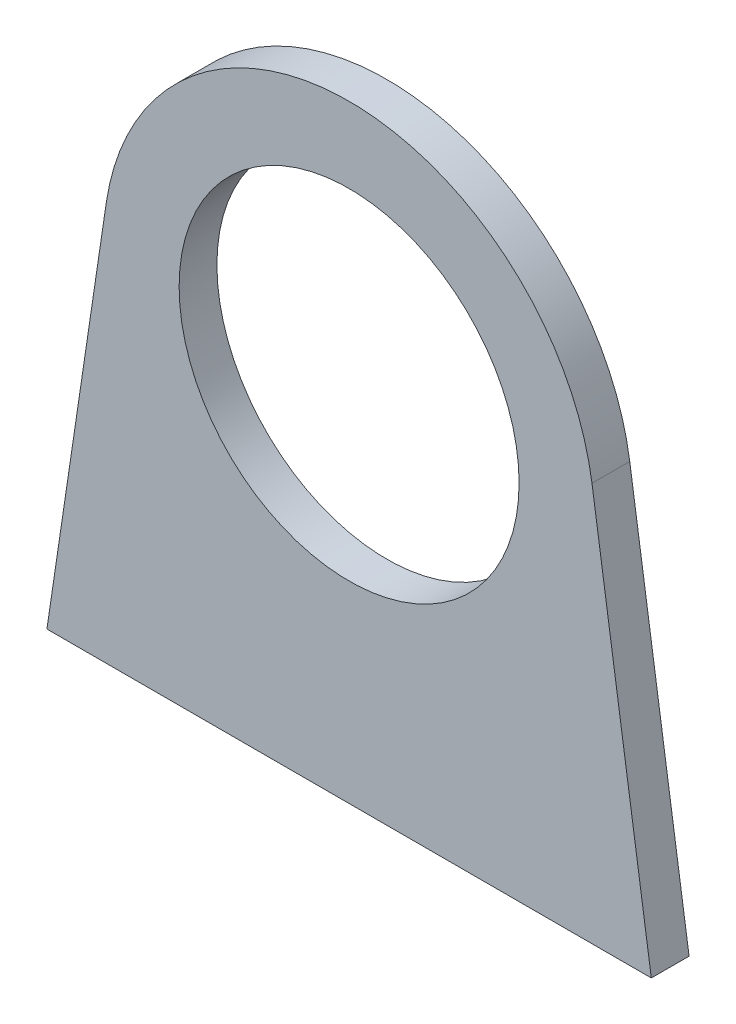
ISO-10303-21;
HEADER;
FILE_DESCRIPTION(('STEP AP214'),'2;1');
FILE_NAME('part.step','',(''),(''),'','','');
FILE_SCHEMA(('AUTOMOTIVE_DESIGN { 1 0 10303 214 1 1 1 1 }'));
ENDSEC;
DATA;
#1=APPLICATION_CONTEXT('core data for automotive mechanical design processes');
#2=APPLICATION_PROTOCOL_DEFINITION('international standard','automotive_design',2000,#1);
#3=PRODUCT_CONTEXT('',#1,'mechanical');
#4=PRODUCT('Part','Part','',(#3));
#5=PRODUCT_RELATED_PRODUCT_CATEGORY('part','',(#4));
#6=PRODUCT_DEFINITION_FORMATION('','',#4);
#7=PRODUCT_DEFINITION_CONTEXT('part definition',#1,'design');
#8=PRODUCT_DEFINITION('design','',#6,#7);
#9=PRODUCT_DEFINITION_SHAPE('','',#8);
#10=(LENGTH_UNIT() NAMED_UNIT(*) SI_UNIT(.MILLI.,.METRE.));
#11=(NAMED_UNIT(*) PLANE_ANGLE_UNIT() SI_UNIT($,.RADIAN.));
#12=(NAMED_UNIT(*) SI_UNIT($,.STERADIAN.) SOLID_ANGLE_UNIT());
#13=UNCERTAINTY_MEASURE_WITH_UNIT(LENGTH_MEASURE(1.E-05),#10,'distance_accuracy_value','');
#14=(GEOMETRIC_REPRESENTATION_CONTEXT(3) GLOBAL_UNCERTAINTY_ASSIGNED_CONTEXT((#13)) GLOBAL_UNIT_ASSIGNED_CONTEXT((#10,
#11,#12)) REPRESENTATION_CONTEXT('',''));
#15=CARTESIAN_POINT('',(0.,0.,0.));
#16=DIRECTION('',(0.,0.,1.));
#17=DIRECTION('',(1.,0.,0.));
#18=AXIS2_PLACEMENT_3D('',#15,#16,#17);
#19=CARTESIAN_POINT('',(0.,0.,3.175));
#20=DIRECTION('',(0.,0.,-1.));
#21=DIRECTION('',(-1.,0.,0.));
#22=AXIS2_PLACEMENT_3D('',#19,#20,#21);
#23=PLANE('',#22);
#24=DIRECTION('',(-0.147175347526362,-0.989110417031635,0.));
#25=VECTOR('',#24,1.);
#26=CARTESIAN_POINT('',(-25.4,-30.48,3.175));
#27=LINE('',#26,#25);
#28=CARTESIAN_POINT('',(-20.4127662314904,3.0373312345753,3.175));
#29=VERTEX_POINT('',#28);
#30=CARTESIAN_POINT('',(-25.4,-30.48,3.175));
#31=VERTEX_POINT('',#30);
#32=EDGE_CURVE('E92',#29,#31,#27,.T.);
#33=ORIENTED_EDGE('',*,*,#32,.T.);
#34=DIRECTION('',(1.,0.,0.));
#35=VECTOR('',#34,1.);
#36=CARTESIAN_POINT('',(-25.4,-30.48,3.175));
#37=LINE('',#36,#35);
#38=CARTESIAN_POINT('',(25.4,-30.48,3.175));
#39=VERTEX_POINT('',#38);
#40=EDGE_CURVE('E87',#31,#39,#37,.T.);
#41=ORIENTED_EDGE('',*,*,#40,.T.);
#42=DIRECTION('',(-0.147175347526362,0.989110417031635,0.));
#43=VECTOR('',#42,1.);
#44=CARTESIAN_POINT('',(20.4127662314904,3.0373312345753,3.175));
#45=LINE('',#44,#43);
#46=CARTESIAN_POINT('',(20.4127662314904,3.0373312345753,3.175));
#47=VERTEX_POINT('',#46);
#48=EDGE_CURVE('E90',#39,#47,#45,.T.);
#49=ORIENTED_EDGE('',*,*,#48,.T.);
#50=CARTESIAN_POINT('',(0.,0.,3.175));
#51=DIRECTION('',(0.,0.,1.));
#52=DIRECTION('',(-1.,0.,0.));
#53=AXIS2_PLACEMENT_3D('',#50,#51,#52);
#54=CIRCLE('',#53,20.6375);
#55=EDGE_CURVE('E57',#47,#29,#54,.T.);
#56=ORIENTED_EDGE('',*,*,#55,.T.);
#57=EDGE_LOOP('',(#33,#41,#49,#56));
#58=FACE_BOUND('',#57,.T.);
#59=CARTESIAN_POINT('',(0.,0.,3.175));
#60=DIRECTION('',(0.,0.,1.));
#61=DIRECTION('',(1.,0.,0.));
#62=AXIS2_PLACEMENT_3D('',#59,#60,#61);
#63=CIRCLE('',#62,14.2875);
#64=CARTESIAN_POINT('',(14.2875,0.,3.175));
#65=VERTEX_POINT('',#64);
#66=EDGE_CURVE('E112',#65,#65,#63,.T.);
#67=ORIENTED_EDGE('',*,*,#66,.F.);
#68=EDGE_LOOP('',(#67));
#69=FACE_BOUND('',#68,.T.);
#70=ADVANCED_FACE('F39',(#58,#69),#23,.F.);
#71=CARTESIAN_POINT('',(0.,0.,0.));
#72=DIRECTION('',(0.,0.,-1.));
#73=DIRECTION('',(-1.,0.,0.));
#74=AXIS2_PLACEMENT_3D('',#71,#72,#73);
#75=PLANE('',#74);
#76=DIRECTION('',(-0.147175347526362,-0.989110417031635,0.));
#77=VECTOR('',#76,1.);
#78=CARTESIAN_POINT('',(-25.4,-30.48,0.));
#79=LINE('',#78,#77);
#80=CARTESIAN_POINT('',(-20.4127662314904,3.0373312345753,0.));
#81=VERTEX_POINT('',#80);
#82=CARTESIAN_POINT('',(-25.4,-30.48,0.));
#83=VERTEX_POINT('',#82);
#84=EDGE_CURVE('E108',#81,#83,#79,.T.);
#85=ORIENTED_EDGE('',*,*,#84,.F.);
#86=CARTESIAN_POINT('',(0.,0.,0.));
#87=DIRECTION('',(0.,0.,1.));
#88=DIRECTION('',(-1.,0.,0.));
#89=AXIS2_PLACEMENT_3D('',#86,#87,#88);
#90=CIRCLE('',#89,20.6375);
#91=CARTESIAN_POINT('',(20.4127662314904,3.0373312345753,0.));
#92=VERTEX_POINT('',#91);
#93=EDGE_CURVE('E80',#92,#81,#90,.T.);
#94=ORIENTED_EDGE('',*,*,#93,.F.);
#95=DIRECTION('',(-0.147175347526362,0.989110417031635,0.));
#96=VECTOR('',#95,1.);
#97=CARTESIAN_POINT('',(20.4127662314904,3.0373312345753,0.));
#98=LINE('',#97,#96);
#99=CARTESIAN_POINT('',(25.4,-30.48,0.));
#100=VERTEX_POINT('',#99);
#101=EDGE_CURVE('E74',#100,#92,#98,.T.);
#102=ORIENTED_EDGE('',*,*,#101,.F.);
#103=DIRECTION('',(1.,0.,0.));
#104=VECTOR('',#103,1.);
#105=CARTESIAN_POINT('',(-25.4,-30.48,0.));
#106=LINE('',#105,#104);
#107=EDGE_CURVE('E97',#83,#100,#106,.T.);
#108=ORIENTED_EDGE('',*,*,#107,.F.);
#109=EDGE_LOOP('',(#85,#94,#102,#108));
#110=FACE_BOUND('',#109,.T.);
#111=CARTESIAN_POINT('',(0.,0.,0.));
#112=DIRECTION('',(0.,0.,1.));
#113=DIRECTION('',(1.,0.,0.));
#114=AXIS2_PLACEMENT_3D('',#111,#112,#113);
#115=CIRCLE('',#114,14.2875);
#116=CARTESIAN_POINT('',(14.2875,0.,0.));
#117=VERTEX_POINT('',#116);
#118=EDGE_CURVE('E130',#117,#117,#115,.T.);
#119=ORIENTED_EDGE('',*,*,#118,.T.);
#120=EDGE_LOOP('',(#119));
#121=FACE_BOUND('',#120,.T.);
#122=ADVANCED_FACE('F125',(#110,#121),#75,.T.);
#123=CARTESIAN_POINT('',(-25.4,-30.48,3.175));
#124=DIRECTION('',(0.989110417031635,-0.147175347526362,0.));
#125=DIRECTION('',(0.147175347526362,0.989110417031635,0.));
#126=AXIS2_PLACEMENT_3D('',#123,#124,#125);
#127=PLANE('',#126);
#128=ORIENTED_EDGE('',*,*,#84,.T.);
#129=DIRECTION('',(0.,0.,-1.));
#130=VECTOR('',#129,1.);
#131=CARTESIAN_POINT('',(-25.4,-30.48,3.175));
#132=LINE('',#131,#130);
#133=EDGE_CURVE('E11',#31,#83,#132,.T.);
#134=ORIENTED_EDGE('',*,*,#133,.F.);
#135=ORIENTED_EDGE('',*,*,#32,.F.);
#136=DIRECTION('',(0.,0.,-1.));
#137=VECTOR('',#136,1.);
#138=CARTESIAN_POINT('',(-20.4127662314904,3.0373312345753,3.175));
#139=LINE('',#138,#137);
#140=EDGE_CURVE('E104',#29,#81,#139,.T.);
#141=ORIENTED_EDGE('',*,*,#140,.T.);
#142=EDGE_LOOP('',(#128,#134,#135,#141));
#143=FACE_BOUND('',#142,.T.);
#144=ADVANCED_FACE('F41',(#143),#127,.F.);
#145=CARTESIAN_POINT('',(-25.4,-30.48,3.175));
#146=DIRECTION('',(0.,1.,0.));
#147=DIRECTION('',(0.,0.,1.));
#148=AXIS2_PLACEMENT_3D('',#145,#146,#147);
#149=PLANE('',#148);
#150=ORIENTED_EDGE('',*,*,#107,.T.);
#151=DIRECTION('',(0.,0.,-1.));
#152=VECTOR('',#151,1.);
#153=CARTESIAN_POINT('',(25.4,-30.48,3.175));
#154=LINE('',#153,#152);
#155=EDGE_CURVE('E49',#39,#100,#154,.T.);
#156=ORIENTED_EDGE('',*,*,#155,.F.);
#157=ORIENTED_EDGE('',*,*,#40,.F.);
#158=ORIENTED_EDGE('',*,*,#133,.T.);
#159=EDGE_LOOP('',(#150,#156,#157,#158));
#160=FACE_BOUND('',#159,.T.);
#161=ADVANCED_FACE('F96',(#160),#149,.F.);
#162=CARTESIAN_POINT('',(20.4127662314904,3.0373312345753,3.175));
#163=DIRECTION('',(-0.989110417031635,-0.147175347526362,0.));
#164=DIRECTION('',(0.147175347526362,-0.989110417031635,0.));
#165=AXIS2_PLACEMENT_3D('',#162,#163,#164);
#166=PLANE('',#165);
#167=ORIENTED_EDGE('',*,*,#101,.T.);
#168=DIRECTION('',(0.,0.,-1.));
#169=VECTOR('',#168,1.);
#170=CARTESIAN_POINT('',(20.4127662314904,3.0373312345753,3.175));
#171=LINE('',#170,#169);
#172=EDGE_CURVE('E99',#47,#92,#171,.T.);
#173=ORIENTED_EDGE('',*,*,#172,.F.);
#174=ORIENTED_EDGE('',*,*,#48,.F.);
#175=ORIENTED_EDGE('',*,*,#155,.T.);
#176=EDGE_LOOP('',(#167,#173,#174,#175));
#177=FACE_BOUND('',#176,.T.);
#178=ADVANCED_FACE('F100',(#177),#166,.F.);
#179=CARTESIAN_POINT('',(0.,0.,3.175));
#180=DIRECTION('',(0.,0.,-1.));
#181=DIRECTION('',(-1.,0.,0.));
#182=AXIS2_PLACEMENT_3D('',#179,#180,#181);
#183=CYLINDRICAL_SURFACE('',#182,20.6375);
#184=ORIENTED_EDGE('',*,*,#93,.T.);
#185=ORIENTED_EDGE('',*,*,#140,.F.);
#186=ORIENTED_EDGE('',*,*,#55,.F.);
#187=ORIENTED_EDGE('',*,*,#172,.T.);
#188=EDGE_LOOP('',(#184,#185,#186,#187));
#189=FACE_BOUND('',#188,.T.);
#190=ADVANCED_FACE('F122',(#189),#183,.T.);
#191=CARTESIAN_POINT('',(0.,0.,3.175));
#192=DIRECTION('',(0.,0.,-1.));
#193=DIRECTION('',(-1.,0.,0.));
#194=AXIS2_PLACEMENT_3D('',#191,#192,#193);
#195=CYLINDRICAL_SURFACE('',#194,14.2875);
#196=ORIENTED_EDGE('',*,*,#66,.T.);
#197=EDGE_LOOP('',(#196));
#198=FACE_BOUND('',#197,.T.);
#199=ORIENTED_EDGE('',*,*,#118,.F.);
#200=EDGE_LOOP('',(#199));
#201=FACE_BOUND('',#200,.T.);
#202=ADVANCED_FACE('F138',(#198,#201),#195,.F.);
#203=CLOSED_SHELL('',(#70,#122,#144,#161,#178,#190,#202));
#204=MANIFOLD_SOLID_BREP('B2',#203);
#205=ADVANCED_BREP_SHAPE_REPRESENTATION('',(#18,#204),#14);
#206=SHAPE_DEFINITION_REPRESENTATION(#9,#205);
ENDSEC;
END-ISO-10303-21;
